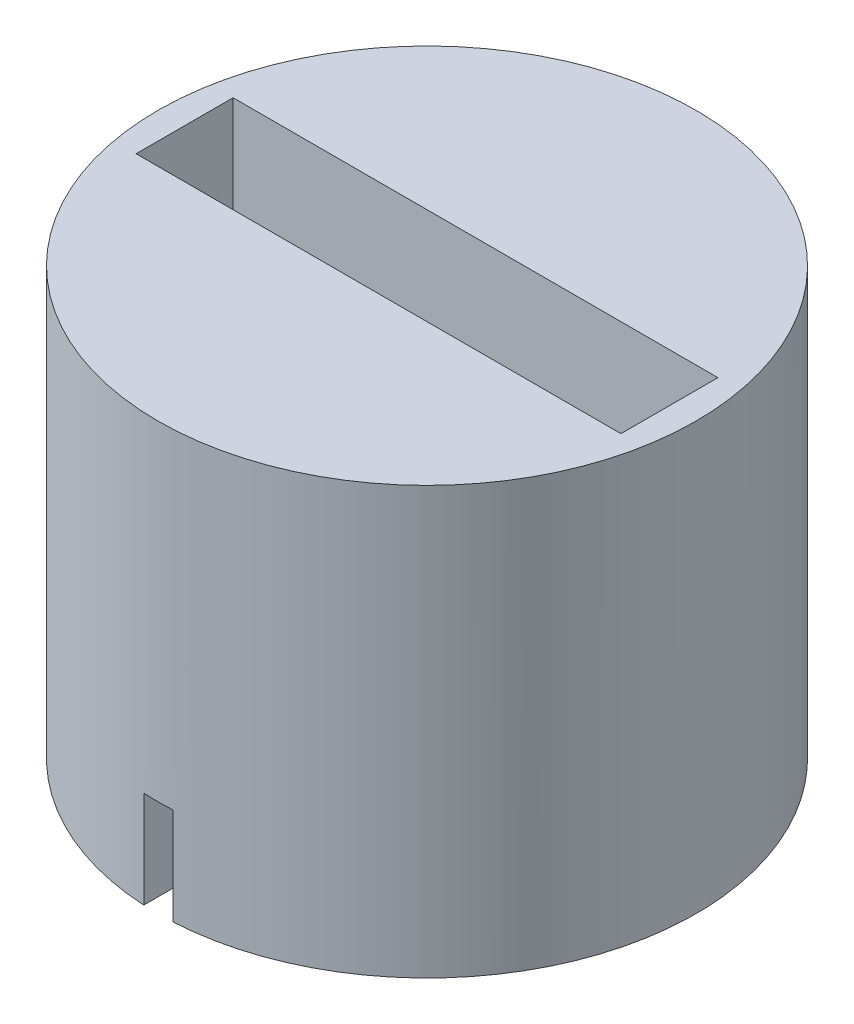
ISO-10303-21;
HEADER;
FILE_DESCRIPTION(('STEP AP214'),'2;1');
FILE_NAME('part.step','',(''),(''),'','','');
FILE_SCHEMA(('AUTOMOTIVE_DESIGN { 1 0 10303 214 1 1 1 1 }'));
ENDSEC;
DATA;
#1=APPLICATION_CONTEXT('core data for automotive mechanical design processes');
#2=APPLICATION_PROTOCOL_DEFINITION('international standard','automotive_design',2000,#1);
#3=PRODUCT_CONTEXT('',#1,'mechanical');
#4=PRODUCT('Part','Part','',(#3));
#5=PRODUCT_RELATED_PRODUCT_CATEGORY('part','',(#4));
#6=PRODUCT_DEFINITION_FORMATION('','',#4);
#7=PRODUCT_DEFINITION_CONTEXT('part definition',#1,'design');
#8=PRODUCT_DEFINITION('design','',#6,#7);
#9=PRODUCT_DEFINITION_SHAPE('','',#8);
#10=(LENGTH_UNIT() NAMED_UNIT(*) SI_UNIT(.MILLI.,.METRE.));
#11=(NAMED_UNIT(*) PLANE_ANGLE_UNIT() SI_UNIT($,.RADIAN.));
#12=(NAMED_UNIT(*) SI_UNIT($,.STERADIAN.) SOLID_ANGLE_UNIT());
#13=UNCERTAINTY_MEASURE_WITH_UNIT(LENGTH_MEASURE(1.E-05),#10,'distance_accuracy_value','');
#14=(GEOMETRIC_REPRESENTATION_CONTEXT(3) GLOBAL_UNCERTAINTY_ASSIGNED_CONTEXT((#13)) GLOBAL_UNIT_ASSIGNED_CONTEXT((#10,
#11,#12)) REPRESENTATION_CONTEXT('',''));
#15=CARTESIAN_POINT('',(0.,0.,0.));
#16=DIRECTION('',(0.,0.,1.));
#17=DIRECTION('',(1.,0.,0.));
#18=AXIS2_PLACEMENT_3D('',#15,#16,#17);
#19=CARTESIAN_POINT('',(0.,22.,0.));
#20=DIRECTION('',(0.,-1.,0.));
#21=DIRECTION('',(0.,0.,-1.));
#22=AXIS2_PLACEMENT_3D('',#19,#20,#21);
#23=CYLINDRICAL_SURFACE('',#22,13.875);
#24=CARTESIAN_POINT('',(0.,5.,0.));
#25=DIRECTION('',(0.,-1.,0.));
#26=DIRECTION('',(0.,0.,-1.));
#27=AXIS2_PLACEMENT_3D('',#24,#25,#26);
#28=CIRCLE('',#27,13.875);
#29=CARTESIAN_POINT('',(-0.750000000000001,5.,-13.8547149014334));
#30=VERTEX_POINT('',#29);
#31=CARTESIAN_POINT('',(0.749999999999999,5.,-13.8547149014334));
#32=VERTEX_POINT('',#31);
#33=EDGE_CURVE('E11',#30,#32,#28,.T.);
#34=ORIENTED_EDGE('',*,*,#33,.F.);
#35=DIRECTION('',(0.,-1.,0.));
#36=VECTOR('',#35,1.);
#37=CARTESIAN_POINT('',(-0.750000000000001,22.,-13.8547149014334));
#38=LINE('',#37,#36);
#39=CARTESIAN_POINT('',(-0.750000000000001,0.,-13.8547149014334));
#40=VERTEX_POINT('',#39);
#41=EDGE_CURVE('E178',#30,#40,#38,.T.);
#42=ORIENTED_EDGE('',*,*,#41,.T.);
#43=CARTESIAN_POINT('',(0.,0.,0.));
#44=DIRECTION('',(0.,1.,0.));
#45=DIRECTION('',(0.,0.,1.));
#46=AXIS2_PLACEMENT_3D('',#43,#44,#45);
#47=CIRCLE('',#46,13.875);
#48=CARTESIAN_POINT('',(-0.750000000000002,0.,13.8547149014334));
#49=VERTEX_POINT('',#48);
#50=EDGE_CURVE('E204',#40,#49,#47,.T.);
#51=ORIENTED_EDGE('',*,*,#50,.T.);
#52=DIRECTION('',(0.,-1.,0.));
#53=VECTOR('',#52,1.);
#54=CARTESIAN_POINT('',(-0.750000000000002,22.,13.8547149014334));
#55=LINE('',#54,#53);
#56=CARTESIAN_POINT('',(-0.750000000000002,5.,13.8547149014334));
#57=VERTEX_POINT('',#56);
#58=EDGE_CURVE('E201',#49,#57,#55,.F.);
#59=ORIENTED_EDGE('',*,*,#58,.T.);
#60=CARTESIAN_POINT('',(0.,5.,0.));
#61=DIRECTION('',(0.,-1.,0.));
#62=DIRECTION('',(0.,0.,-1.));
#63=AXIS2_PLACEMENT_3D('',#60,#61,#62);
#64=CIRCLE('',#63,13.875);
#65=CARTESIAN_POINT('',(0.749999999999998,5.,13.8547149014334));
#66=VERTEX_POINT('',#65);
#67=EDGE_CURVE('E214',#66,#57,#64,.T.);
#68=ORIENTED_EDGE('',*,*,#67,.F.);
#69=DIRECTION('',(0.,-1.,0.));
#70=VECTOR('',#69,1.);
#71=CARTESIAN_POINT('',(0.749999999999998,22.,13.8547149014334));
#72=LINE('',#71,#70);
#73=CARTESIAN_POINT('',(0.749999999999998,0.,13.8547149014334));
#74=VERTEX_POINT('',#73);
#75=EDGE_CURVE('E197',#66,#74,#72,.T.);
#76=ORIENTED_EDGE('',*,*,#75,.T.);
#77=CARTESIAN_POINT('',(0.749999999999999,0.,-13.8547149014334));
#78=VERTEX_POINT('',#77);
#79=EDGE_CURVE('E209',#74,#78,#47,.T.);
#80=ORIENTED_EDGE('',*,*,#79,.T.);
#81=DIRECTION('',(0.,-1.,0.));
#82=VECTOR('',#81,1.);
#83=CARTESIAN_POINT('',(0.749999999999999,22.,-13.8547149014334));
#84=LINE('',#83,#82);
#85=EDGE_CURVE('E55',#78,#32,#84,.F.);
#86=ORIENTED_EDGE('',*,*,#85,.T.);
#87=EDGE_LOOP('',(#34,#42,#51,#59,#68,#76,#80,#86));
#88=FACE_BOUND('',#87,.T.);
#89=CARTESIAN_POINT('',(0.,22.,0.));
#90=DIRECTION('',(0.,1.,0.));
#91=DIRECTION('',(0.,0.,1.));
#92=AXIS2_PLACEMENT_3D('',#89,#90,#91);
#93=CIRCLE('',#92,13.875);
#94=CARTESIAN_POINT('',(0.,22.,13.875));
#95=VERTEX_POINT('',#94);
#96=EDGE_CURVE('E205',#95,#95,#93,.T.);
#97=ORIENTED_EDGE('',*,*,#96,.F.);
#98=EDGE_LOOP('',(#97));
#99=FACE_BOUND('',#98,.T.);
#100=ADVANCED_FACE('F33',(#88,#99),#23,.T.);
#101=CARTESIAN_POINT('',(0.,22.,0.));
#102=DIRECTION('',(0.,1.,0.));
#103=DIRECTION('',(0.,0.,1.));
#104=AXIS2_PLACEMENT_3D('',#101,#102,#103);
#105=PLANE('',#104);
#106=DIRECTION('',(-1.,0.,0.));
#107=VECTOR('',#106,1.);
#108=CARTESIAN_POINT('',(12.5,22.,-2.50000000000004));
#109=LINE('',#108,#107);
#110=CARTESIAN_POINT('',(12.5,22.,-2.50000000000004));
#111=VERTEX_POINT('',#110);
#112=CARTESIAN_POINT('',(-12.5,22.,-2.49999999999996));
#113=VERTEX_POINT('',#112);
#114=EDGE_CURVE('E47',#111,#113,#109,.T.);
#115=ORIENTED_EDGE('',*,*,#114,.F.);
#116=DIRECTION('',(0.,0.,-1.));
#117=VECTOR('',#116,1.);
#118=CARTESIAN_POINT('',(12.5,22.,-2.50000000000004));
#119=LINE('',#118,#117);
#120=CARTESIAN_POINT('',(12.5,22.,2.49999999999996));
#121=VERTEX_POINT('',#120);
#122=EDGE_CURVE('E141',#121,#111,#119,.T.);
#123=ORIENTED_EDGE('',*,*,#122,.F.);
#124=DIRECTION('',(1.,0.,0.));
#125=VECTOR('',#124,1.);
#126=CARTESIAN_POINT('',(12.5,22.,2.49999999999996));
#127=LINE('',#126,#125);
#128=CARTESIAN_POINT('',(-12.5,22.,2.50000000000004));
#129=VERTEX_POINT('',#128);
#130=EDGE_CURVE('E144',#129,#121,#127,.T.);
#131=ORIENTED_EDGE('',*,*,#130,.F.);
#132=DIRECTION('',(0.,0.,1.));
#133=VECTOR('',#132,1.);
#134=CARTESIAN_POINT('',(-12.5,22.,-2.49999999999996));
#135=LINE('',#134,#133);
#136=EDGE_CURVE('E150',#113,#129,#135,.T.);
#137=ORIENTED_EDGE('',*,*,#136,.F.);
#138=EDGE_LOOP('',(#115,#123,#131,#137));
#139=FACE_BOUND('',#138,.T.);
#140=ORIENTED_EDGE('',*,*,#96,.T.);
#141=EDGE_LOOP('',(#140));
#142=FACE_BOUND('',#141,.T.);
#143=ADVANCED_FACE('F260',(#139,#142),#105,.T.);
#144=CARTESIAN_POINT('',(0.,0.,0.));
#145=DIRECTION('',(0.,1.,0.));
#146=DIRECTION('',(0.,0.,1.));
#147=AXIS2_PLACEMENT_3D('',#144,#145,#146);
#148=PLANE('',#147);
#149=ORIENTED_EDGE('',*,*,#50,.F.);
#150=DIRECTION('',(0.,0.,-1.));
#151=VECTOR('',#150,1.);
#152=CARTESIAN_POINT('',(-0.750000000000002,0.,-12.));
#153=LINE('',#152,#151);
#154=CARTESIAN_POINT('',(-0.750000000000002,0.,-12.));
#155=VERTEX_POINT('',#154);
#156=EDGE_CURVE('E156',#155,#40,#153,.T.);
#157=ORIENTED_EDGE('',*,*,#156,.F.);
#158=DIRECTION('',(-1.,0.,0.));
#159=VECTOR('',#158,1.);
#160=CARTESIAN_POINT('',(-0.750000000000002,0.,-12.));
#161=LINE('',#160,#159);
#162=CARTESIAN_POINT('',(0.749999999999999,0.,-12.));
#163=VERTEX_POINT('',#162);
#164=EDGE_CURVE('E164',#163,#155,#161,.T.);
#165=ORIENTED_EDGE('',*,*,#164,.F.);
#166=DIRECTION('',(0.,0.,-1.));
#167=VECTOR('',#166,1.);
#168=CARTESIAN_POINT('',(0.749999999999997,0.,0.));
#169=LINE('',#168,#167);
#170=EDGE_CURVE('E40',#163,#78,#169,.T.);
#171=ORIENTED_EDGE('',*,*,#170,.T.);
#172=ORIENTED_EDGE('',*,*,#79,.F.);
#173=DIRECTION('',(0.,0.,1.));
#174=VECTOR('',#173,1.);
#175=CARTESIAN_POINT('',(0.749999999999998,0.,14.924695475638));
#176=LINE('',#175,#174);
#177=CARTESIAN_POINT('',(0.749999999999998,0.,12.));
#178=VERTEX_POINT('',#177);
#179=EDGE_CURVE('E185',#178,#74,#176,.T.);
#180=ORIENTED_EDGE('',*,*,#179,.F.);
#181=DIRECTION('',(1.,0.,0.));
#182=VECTOR('',#181,1.);
#183=CARTESIAN_POINT('',(-0.750000000000002,0.,12.));
#184=LINE('',#183,#182);
#185=CARTESIAN_POINT('',(-0.750000000000002,0.,12.));
#186=VERTEX_POINT('',#185);
#187=EDGE_CURVE('E181',#186,#178,#184,.T.);
#188=ORIENTED_EDGE('',*,*,#187,.F.);
#189=DIRECTION('',(0.,0.,1.));
#190=VECTOR('',#189,1.);
#191=CARTESIAN_POINT('',(-0.75,0.,0.));
#192=LINE('',#191,#190);
#193=EDGE_CURVE('E208',#186,#49,#192,.T.);
#194=ORIENTED_EDGE('',*,*,#193,.T.);
#195=EDGE_LOOP('',(#149,#157,#165,#171,#172,#180,#188,#194));
#196=FACE_BOUND('',#195,.T.);
#197=ADVANCED_FACE('F219',(#196),#148,.F.);
#198=CARTESIAN_POINT('',(0.,5.,0.));
#199=DIRECTION('',(0.,-1.,0.));
#200=DIRECTION('',(0.,0.,-1.));
#201=AXIS2_PLACEMENT_3D('',#198,#199,#200);
#202=PLANE('',#201);
#203=ORIENTED_EDGE('',*,*,#67,.T.);
#204=DIRECTION('',(0.,0.,-1.));
#205=VECTOR('',#204,1.);
#206=CARTESIAN_POINT('',(-0.750000000000002,5.,14.924695475638));
#207=LINE('',#206,#205);
#208=CARTESIAN_POINT('',(-0.750000000000002,5.,12.));
#209=VERTEX_POINT('',#208);
#210=EDGE_CURVE('E182',#57,#209,#207,.T.);
#211=ORIENTED_EDGE('',*,*,#210,.T.);
#212=DIRECTION('',(1.,0.,0.));
#213=VECTOR('',#212,1.);
#214=CARTESIAN_POINT('',(-0.750000000000002,5.,12.));
#215=LINE('',#214,#213);
#216=CARTESIAN_POINT('',(0.749999999999998,5.,12.));
#217=VERTEX_POINT('',#216);
#218=EDGE_CURVE('E184',#209,#217,#215,.T.);
#219=ORIENTED_EDGE('',*,*,#218,.T.);
#220=DIRECTION('',(0.,0.,1.));
#221=VECTOR('',#220,1.);
#222=CARTESIAN_POINT('',(0.749999999999998,5.,14.924695475638));
#223=LINE('',#222,#221);
#224=EDGE_CURVE('E188',#217,#66,#223,.T.);
#225=ORIENTED_EDGE('',*,*,#224,.T.);
#226=EDGE_LOOP('',(#203,#211,#219,#225));
#227=FACE_BOUND('',#226,.T.);
#228=ADVANCED_FACE('F231',(#227),#202,.T.);
#229=CARTESIAN_POINT('',(-0.750000000000002,5.,14.924695475638));
#230=DIRECTION('',(-1.,0.,0.));
#231=DIRECTION('',(0.,0.,1.));
#232=AXIS2_PLACEMENT_3D('',#229,#230,#231);
#233=PLANE('',#232);
#234=ORIENTED_EDGE('',*,*,#193,.F.);
#235=DIRECTION('',(0.,-1.,0.));
#236=VECTOR('',#235,1.);
#237=CARTESIAN_POINT('',(-0.750000000000002,5.,12.));
#238=LINE('',#237,#236);
#239=EDGE_CURVE('E191',#209,#186,#238,.T.);
#240=ORIENTED_EDGE('',*,*,#239,.F.);
#241=ORIENTED_EDGE('',*,*,#210,.F.);
#242=ORIENTED_EDGE('',*,*,#58,.F.);
#243=EDGE_LOOP('',(#234,#240,#241,#242));
#244=FACE_BOUND('',#243,.T.);
#245=ADVANCED_FACE('F241',(#244),#233,.F.);
#246=CARTESIAN_POINT('',(0.749999999999998,5.,14.924695475638));
#247=DIRECTION('',(1.,0.,0.));
#248=DIRECTION('',(0.,0.,-1.));
#249=AXIS2_PLACEMENT_3D('',#246,#247,#248);
#250=PLANE('',#249);
#251=ORIENTED_EDGE('',*,*,#224,.F.);
#252=DIRECTION('',(0.,-1.,0.));
#253=VECTOR('',#252,1.);
#254=CARTESIAN_POINT('',(0.749999999999998,5.,12.));
#255=LINE('',#254,#253);
#256=EDGE_CURVE('E195',#217,#178,#255,.T.);
#257=ORIENTED_EDGE('',*,*,#256,.T.);
#258=ORIENTED_EDGE('',*,*,#179,.T.);
#259=ORIENTED_EDGE('',*,*,#75,.F.);
#260=EDGE_LOOP('',(#251,#257,#258,#259));
#261=FACE_BOUND('',#260,.T.);
#262=ADVANCED_FACE('F229',(#261),#250,.F.);
#263=CARTESIAN_POINT('',(-0.750000000000002,5.,12.));
#264=DIRECTION('',(0.,0.,-1.));
#265=DIRECTION('',(-1.,0.,0.));
#266=AXIS2_PLACEMENT_3D('',#263,#264,#265);
#267=PLANE('',#266);
#268=ORIENTED_EDGE('',*,*,#187,.T.);
#269=ORIENTED_EDGE('',*,*,#256,.F.);
#270=ORIENTED_EDGE('',*,*,#218,.F.);
#271=ORIENTED_EDGE('',*,*,#239,.T.);
#272=EDGE_LOOP('',(#268,#269,#270,#271));
#273=FACE_BOUND('',#272,.T.);
#274=ADVANCED_FACE('F236',(#273),#267,.F.);
#275=CARTESIAN_POINT('',(0.,5.,0.));
#276=DIRECTION('',(0.,-1.,0.));
#277=DIRECTION('',(0.,0.,-1.));
#278=AXIS2_PLACEMENT_3D('',#275,#276,#277);
#279=PLANE('',#278);
#280=ORIENTED_EDGE('',*,*,#33,.T.);
#281=DIRECTION('',(0.,0.,1.));
#282=VECTOR('',#281,1.);
#283=CARTESIAN_POINT('',(0.749999999999999,5.,-12.));
#284=LINE('',#283,#282);
#285=CARTESIAN_POINT('',(0.749999999999999,5.,-12.));
#286=VERTEX_POINT('',#285);
#287=EDGE_CURVE('E163',#32,#286,#284,.T.);
#288=ORIENTED_EDGE('',*,*,#287,.T.);
#289=DIRECTION('',(-1.,0.,0.));
#290=VECTOR('',#289,1.);
#291=CARTESIAN_POINT('',(-0.750000000000002,5.,-12.));
#292=LINE('',#291,#290);
#293=CARTESIAN_POINT('',(-0.750000000000002,5.,-12.));
#294=VERTEX_POINT('',#293);
#295=EDGE_CURVE('E166',#286,#294,#292,.T.);
#296=ORIENTED_EDGE('',*,*,#295,.T.);
#297=DIRECTION('',(0.,0.,-1.));
#298=VECTOR('',#297,1.);
#299=CARTESIAN_POINT('',(-0.750000000000002,5.,-12.));
#300=LINE('',#299,#298);
#301=EDGE_CURVE('E160',#294,#30,#300,.T.);
#302=ORIENTED_EDGE('',*,*,#301,.T.);
#303=EDGE_LOOP('',(#280,#288,#296,#302));
#304=FACE_BOUND('',#303,.T.);
#305=ADVANCED_FACE('F246',(#304),#279,.T.);
#306=CARTESIAN_POINT('',(-0.750000000000002,5.,-12.));
#307=DIRECTION('',(-1.,0.,0.));
#308=DIRECTION('',(0.,0.,1.));
#309=AXIS2_PLACEMENT_3D('',#306,#307,#308);
#310=PLANE('',#309);
#311=ORIENTED_EDGE('',*,*,#301,.F.);
#312=DIRECTION('',(0.,-1.,0.));
#313=VECTOR('',#312,1.);
#314=CARTESIAN_POINT('',(-0.750000000000002,5.,-12.));
#315=LINE('',#314,#313);
#316=EDGE_CURVE('E173',#294,#155,#315,.T.);
#317=ORIENTED_EDGE('',*,*,#316,.T.);
#318=ORIENTED_EDGE('',*,*,#156,.T.);
#319=ORIENTED_EDGE('',*,*,#41,.F.);
#320=EDGE_LOOP('',(#311,#317,#318,#319));
#321=FACE_BOUND('',#320,.T.);
#322=ADVANCED_FACE('F244',(#321),#310,.F.);
#323=CARTESIAN_POINT('',(0.749999999999999,5.,-12.));
#324=DIRECTION('',(1.,0.,0.));
#325=DIRECTION('',(0.,0.,-1.));
#326=AXIS2_PLACEMENT_3D('',#323,#324,#325);
#327=PLANE('',#326);
#328=ORIENTED_EDGE('',*,*,#170,.F.);
#329=DIRECTION('',(0.,-1.,0.));
#330=VECTOR('',#329,1.);
#331=CARTESIAN_POINT('',(0.749999999999999,5.,-12.));
#332=LINE('',#331,#330);
#333=EDGE_CURVE('E169',#286,#163,#332,.T.);
#334=ORIENTED_EDGE('',*,*,#333,.F.);
#335=ORIENTED_EDGE('',*,*,#287,.F.);
#336=ORIENTED_EDGE('',*,*,#85,.F.);
#337=EDGE_LOOP('',(#328,#334,#335,#336));
#338=FACE_BOUND('',#337,.T.);
#339=ADVANCED_FACE('F250',(#338),#327,.F.);
#340=CARTESIAN_POINT('',(-0.750000000000002,5.,-12.));
#341=DIRECTION('',(0.,0.,1.));
#342=DIRECTION('',(1.,0.,0.));
#343=AXIS2_PLACEMENT_3D('',#340,#341,#342);
#344=PLANE('',#343);
#345=ORIENTED_EDGE('',*,*,#164,.T.);
#346=ORIENTED_EDGE('',*,*,#316,.F.);
#347=ORIENTED_EDGE('',*,*,#295,.F.);
#348=ORIENTED_EDGE('',*,*,#333,.T.);
#349=EDGE_LOOP('',(#345,#346,#347,#348));
#350=FACE_BOUND('',#349,.T.);
#351=ADVANCED_FACE('F249',(#350),#344,.F.);
#352=CARTESIAN_POINT('',(12.5,2.,-2.50000000000004));
#353=DIRECTION('',(0.,0.,-1.));
#354=DIRECTION('',(-1.,0.,0.));
#355=AXIS2_PLACEMENT_3D('',#352,#353,#354);
#356=PLANE('',#355);
#357=ORIENTED_EDGE('',*,*,#114,.T.);
#358=DIRECTION('',(0.,1.,0.));
#359=VECTOR('',#358,1.);
#360=CARTESIAN_POINT('',(-12.5,2.,-2.49999999999996));
#361=LINE('',#360,#359);
#362=CARTESIAN_POINT('',(-12.5,2.,-2.49999999999996));
#363=VERTEX_POINT('',#362);
#364=EDGE_CURVE('E119',#363,#113,#361,.T.);
#365=ORIENTED_EDGE('',*,*,#364,.F.);
#366=DIRECTION('',(-1.,0.,0.));
#367=VECTOR('',#366,1.);
#368=CARTESIAN_POINT('',(12.5,2.,-2.50000000000004));
#369=LINE('',#368,#367);
#370=CARTESIAN_POINT('',(12.5,2.,-2.50000000000004));
#371=VERTEX_POINT('',#370);
#372=EDGE_CURVE('E123',#371,#363,#369,.T.);
#373=ORIENTED_EDGE('',*,*,#372,.F.);
#374=DIRECTION('',(0.,1.,0.));
#375=VECTOR('',#374,1.);
#376=CARTESIAN_POINT('',(12.5,2.,-2.50000000000004));
#377=LINE('',#376,#375);
#378=EDGE_CURVE('E154',#371,#111,#377,.T.);
#379=ORIENTED_EDGE('',*,*,#378,.T.);
#380=EDGE_LOOP('',(#357,#365,#373,#379));
#381=FACE_BOUND('',#380,.T.);
#382=ADVANCED_FACE('F121',(#381),#356,.F.);
#383=CARTESIAN_POINT('',(12.5,2.,-2.50000000000004));
#384=DIRECTION('',(1.,0.,0.));
#385=DIRECTION('',(0.,0.,-1.));
#386=AXIS2_PLACEMENT_3D('',#383,#384,#385);
#387=PLANE('',#386);
#388=ORIENTED_EDGE('',*,*,#122,.T.);
#389=ORIENTED_EDGE('',*,*,#378,.F.);
#390=DIRECTION('',(0.,0.,-1.));
#391=VECTOR('',#390,1.);
#392=CARTESIAN_POINT('',(12.5,2.,-2.50000000000004));
#393=LINE('',#392,#391);
#394=CARTESIAN_POINT('',(12.5,2.,2.49999999999996));
#395=VERTEX_POINT('',#394);
#396=EDGE_CURVE('E129',#395,#371,#393,.T.);
#397=ORIENTED_EDGE('',*,*,#396,.F.);
#398=DIRECTION('',(0.,1.,0.));
#399=VECTOR('',#398,1.);
#400=CARTESIAN_POINT('',(12.5,2.,2.49999999999996));
#401=LINE('',#400,#399);
#402=EDGE_CURVE('E157',#395,#121,#401,.T.);
#403=ORIENTED_EDGE('',*,*,#402,.T.);
#404=EDGE_LOOP('',(#388,#389,#397,#403));
#405=FACE_BOUND('',#404,.T.);
#406=ADVANCED_FACE('F329',(#405),#387,.F.);
#407=CARTESIAN_POINT('',(12.5,2.,2.49999999999996));
#408=DIRECTION('',(0.,0.,1.));
#409=DIRECTION('',(1.,0.,0.));
#410=AXIS2_PLACEMENT_3D('',#407,#408,#409);
#411=PLANE('',#410);
#412=ORIENTED_EDGE('',*,*,#130,.T.);
#413=ORIENTED_EDGE('',*,*,#402,.F.);
#414=DIRECTION('',(1.,0.,0.));
#415=VECTOR('',#414,1.);
#416=CARTESIAN_POINT('',(12.5,2.,2.49999999999996));
#417=LINE('',#416,#415);
#418=CARTESIAN_POINT('',(-12.5,2.,2.50000000000004));
#419=VERTEX_POINT('',#418);
#420=EDGE_CURVE('E137',#419,#395,#417,.T.);
#421=ORIENTED_EDGE('',*,*,#420,.F.);
#422=DIRECTION('',(0.,1.,0.));
#423=VECTOR('',#422,1.);
#424=CARTESIAN_POINT('',(-12.5,2.,2.50000000000004));
#425=LINE('',#424,#423);
#426=EDGE_CURVE('E128',#419,#129,#425,.T.);
#427=ORIENTED_EDGE('',*,*,#426,.T.);
#428=EDGE_LOOP('',(#412,#413,#421,#427));
#429=FACE_BOUND('',#428,.T.);
#430=ADVANCED_FACE('F338',(#429),#411,.F.);
#431=CARTESIAN_POINT('',(-12.5,2.,-2.49999999999996));
#432=DIRECTION('',(-1.,0.,0.));
#433=DIRECTION('',(0.,0.,1.));
#434=AXIS2_PLACEMENT_3D('',#431,#432,#433);
#435=PLANE('',#434);
#436=ORIENTED_EDGE('',*,*,#136,.T.);
#437=ORIENTED_EDGE('',*,*,#426,.F.);
#438=DIRECTION('',(0.,0.,1.));
#439=VECTOR('',#438,1.);
#440=CARTESIAN_POINT('',(-12.5,2.,-2.49999999999996));
#441=LINE('',#440,#439);
#442=EDGE_CURVE('E132',#363,#419,#441,.T.);
#443=ORIENTED_EDGE('',*,*,#442,.F.);
#444=ORIENTED_EDGE('',*,*,#364,.T.);
#445=EDGE_LOOP('',(#436,#437,#443,#444));
#446=FACE_BOUND('',#445,.T.);
#447=ADVANCED_FACE('F133',(#446),#435,.F.);
#448=CARTESIAN_POINT('',(0.,2.,0.));
#449=DIRECTION('',(0.,1.,0.));
#450=DIRECTION('',(0.,0.,1.));
#451=AXIS2_PLACEMENT_3D('',#448,#449,#450);
#452=PLANE('',#451);
#453=ORIENTED_EDGE('',*,*,#372,.T.);
#454=ORIENTED_EDGE('',*,*,#442,.T.);
#455=ORIENTED_EDGE('',*,*,#420,.T.);
#456=ORIENTED_EDGE('',*,*,#396,.T.);
#457=EDGE_LOOP('',(#453,#454,#455,#456));
#458=FACE_BOUND('',#457,.T.);
#459=ADVANCED_FACE('F139',(#458),#452,.T.);
#460=CLOSED_SHELL('',(#100,#143,#197,#228,#245,#262,#274,#305,#322,#339,#351,#382,#406,#430,
#447,#459));
#461=MANIFOLD_SOLID_BREP('B2',#460);
#462=ADVANCED_BREP_SHAPE_REPRESENTATION('',(#18,#461),#14);
#463=SHAPE_DEFINITION_REPRESENTATION(#9,#462);
ENDSEC;
END-ISO-10303-21;
